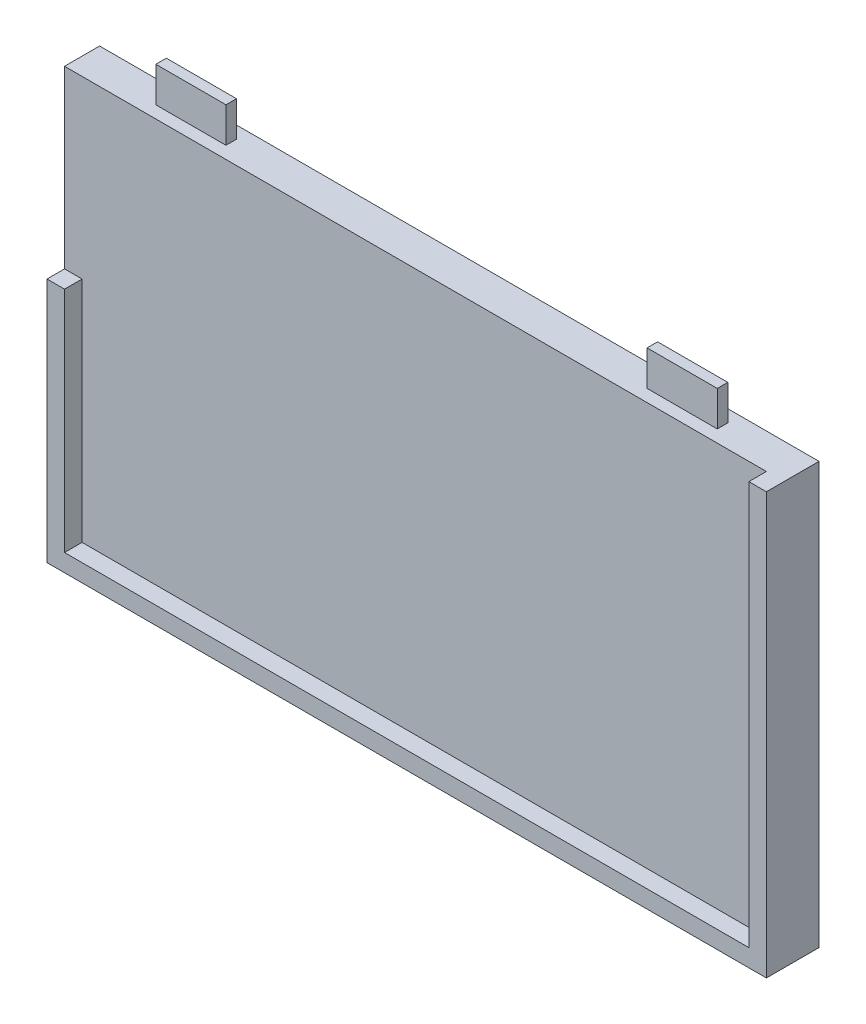
ISO-10303-21;
HEADER;
FILE_DESCRIPTION(('STEP AP214'),'2;1');
FILE_NAME('part.step','',(''),(''),'','','');
FILE_SCHEMA(('AUTOMOTIVE_DESIGN { 1 0 10303 214 1 1 1 1 }'));
ENDSEC;
DATA;
#1=APPLICATION_CONTEXT('core data for automotive mechanical design processes');
#2=APPLICATION_PROTOCOL_DEFINITION('international standard','automotive_design',2000,#1);
#3=PRODUCT_CONTEXT('',#1,'mechanical');
#4=PRODUCT('Part','Part','',(#3));
#5=PRODUCT_RELATED_PRODUCT_CATEGORY('part','',(#4));
#6=PRODUCT_DEFINITION_FORMATION('','',#4);
#7=PRODUCT_DEFINITION_CONTEXT('part definition',#1,'design');
#8=PRODUCT_DEFINITION('design','',#6,#7);
#9=PRODUCT_DEFINITION_SHAPE('','',#8);
#10=(LENGTH_UNIT() NAMED_UNIT(*) SI_UNIT(.MILLI.,.METRE.));
#11=(NAMED_UNIT(*) PLANE_ANGLE_UNIT() SI_UNIT($,.RADIAN.));
#12=(NAMED_UNIT(*) SI_UNIT($,.STERADIAN.) SOLID_ANGLE_UNIT());
#13=UNCERTAINTY_MEASURE_WITH_UNIT(LENGTH_MEASURE(1.E-05),#10,'distance_accuracy_value','');
#14=(GEOMETRIC_REPRESENTATION_CONTEXT(3) GLOBAL_UNCERTAINTY_ASSIGNED_CONTEXT((#13)) GLOBAL_UNIT_ASSIGNED_CONTEXT((#10,
#11,#12)) REPRESENTATION_CONTEXT('',''));
#15=CARTESIAN_POINT('',(0.,0.,0.));
#16=DIRECTION('',(0.,0.,1.));
#17=DIRECTION('',(1.,0.,0.));
#18=AXIS2_PLACEMENT_3D('',#15,#16,#17);
#19=CARTESIAN_POINT('',(102.5,-60.,10.));
#20=DIRECTION('',(0.,1.,0.));
#21=DIRECTION('',(0.,0.,1.));
#22=AXIS2_PLACEMENT_3D('',#19,#20,#21);
#23=PLANE('',#22);
#24=DIRECTION('',(0.,0.,1.));
#25=VECTOR('',#24,1.);
#26=CARTESIAN_POINT('',(17.6,-60.,0.));
#27=LINE('',#26,#25);
#28=CARTESIAN_POINT('',(17.6,-60.,0.));
#29=VERTEX_POINT('',#28);
#30=CARTESIAN_POINT('',(17.6,-60.,3.2));
#31=VERTEX_POINT('',#30);
#32=EDGE_CURVE('E238',#29,#31,#27,.T.);
#33=ORIENTED_EDGE('',*,*,#32,.F.);
#34=DIRECTION('',(1.,0.,0.));
#35=VECTOR('',#34,1.);
#36=CARTESIAN_POINT('',(102.5,-60.,0.));
#37=LINE('',#36,#35);
#38=CARTESIAN_POINT('',(102.5,-60.,0.));
#39=VERTEX_POINT('',#38);
#40=EDGE_CURVE('E450',#29,#39,#37,.T.);
#41=ORIENTED_EDGE('',*,*,#40,.T.);
#42=DIRECTION('',(0.,0.,-1.));
#43=VECTOR('',#42,1.);
#44=CARTESIAN_POINT('',(102.5,-60.,10.));
#45=LINE('',#44,#43);
#46=CARTESIAN_POINT('',(102.5,-60.,15.));
#47=VERTEX_POINT('',#46);
#48=EDGE_CURVE('E453',#47,#39,#45,.T.);
#49=ORIENTED_EDGE('',*,*,#48,.F.);
#50=DIRECTION('',(1.,0.,0.));
#51=VECTOR('',#50,1.);
#52=CARTESIAN_POINT('',(102.5,-60.,15.));
#53=LINE('',#52,#51);
#54=CARTESIAN_POINT('',(-102.5,-60.0000000000001,15.));
#55=VERTEX_POINT('',#54);
#56=EDGE_CURVE('E400',#55,#47,#53,.T.);
#57=ORIENTED_EDGE('',*,*,#56,.F.);
#58=DIRECTION('',(0.,0.,-1.));
#59=VECTOR('',#58,1.);
#60=CARTESIAN_POINT('',(-102.5,-60.,10.));
#61=LINE('',#60,#59);
#62=CARTESIAN_POINT('',(-102.5,-60.,0.));
#63=VERTEX_POINT('',#62);
#64=EDGE_CURVE('E46',#55,#63,#61,.T.);
#65=ORIENTED_EDGE('',*,*,#64,.T.);
#66=CARTESIAN_POINT('',(-17.6,-60.,-2.09488880330588E-13));
#67=VERTEX_POINT('',#66);
#68=EDGE_CURVE('E449',#63,#67,#37,.T.);
#69=ORIENTED_EDGE('',*,*,#68,.T.);
#70=DIRECTION('',(0.,0.,-1.));
#71=VECTOR('',#70,1.);
#72=CARTESIAN_POINT('',(-17.6,-60.,-2.09488880330588E-13));
#73=LINE('',#72,#71);
#74=CARTESIAN_POINT('',(-17.6,-60.,3.19999999999979));
#75=VERTEX_POINT('',#74);
#76=EDGE_CURVE('E279',#75,#67,#73,.T.);
#77=ORIENTED_EDGE('',*,*,#76,.F.);
#78=DIRECTION('',(-1.,0.,0.));
#79=VECTOR('',#78,1.);
#80=CARTESIAN_POINT('',(-17.6,-60.,3.19999999999979));
#81=LINE('',#80,#79);
#82=CARTESIAN_POINT('',(-12.4,-60.,3.19999999999979));
#83=VERTEX_POINT('',#82);
#84=EDGE_CURVE('E278',#83,#75,#81,.T.);
#85=ORIENTED_EDGE('',*,*,#84,.F.);
#86=DIRECTION('',(0.,0.,1.));
#87=VECTOR('',#86,1.);
#88=CARTESIAN_POINT('',(-12.4,-60.,-2.09488880330588E-13));
#89=LINE('',#88,#87);
#90=CARTESIAN_POINT('',(-12.4,-60.,-2.09488880330588E-13));
#91=VERTEX_POINT('',#90);
#92=EDGE_CURVE('E256',#91,#83,#89,.T.);
#93=ORIENTED_EDGE('',*,*,#92,.F.);
#94=CARTESIAN_POINT('',(12.4,-60.,0.));
#95=VERTEX_POINT('',#94);
#96=EDGE_CURVE('E452',#91,#95,#37,.T.);
#97=ORIENTED_EDGE('',*,*,#96,.T.);
#98=DIRECTION('',(0.,0.,-1.));
#99=VECTOR('',#98,1.);
#100=CARTESIAN_POINT('',(12.4,-60.,0.));
#101=LINE('',#100,#99);
#102=CARTESIAN_POINT('',(12.4,-60.,3.2));
#103=VERTEX_POINT('',#102);
#104=EDGE_CURVE('E252',#103,#95,#101,.T.);
#105=ORIENTED_EDGE('',*,*,#104,.F.);
#106=DIRECTION('',(-1.,0.,0.));
#107=VECTOR('',#106,1.);
#108=CARTESIAN_POINT('',(12.4,-60.,3.2));
#109=LINE('',#108,#107);
#110=EDGE_CURVE('E254',#31,#103,#109,.T.);
#111=ORIENTED_EDGE('',*,*,#110,.F.);
#112=EDGE_LOOP('',(#33,#41,#49,#57,#65,#69,#77,#85,#93,#97,#105,#111));
#113=FACE_BOUND('',#112,.T.);
#114=ADVANCED_FACE('F36',(#113),#23,.F.);
#115=CARTESIAN_POINT('',(0.,0.,0.));
#116=DIRECTION('',(0.,0.,-1.));
#117=DIRECTION('',(-1.,0.,0.));
#118=AXIS2_PLACEMENT_3D('',#115,#116,#117);
#119=PLANE('',#118);
#120=DIRECTION('',(1.,0.,0.));
#121=VECTOR('',#120,1.);
#122=CARTESIAN_POINT('',(12.4,-55.,0.));
#123=LINE('',#122,#121);
#124=CARTESIAN_POINT('',(12.4,-55.,0.));
#125=VERTEX_POINT('',#124);
#126=CARTESIAN_POINT('',(17.6,-55.,0.));
#127=VERTEX_POINT('',#126);
#128=EDGE_CURVE('E243',#125,#127,#123,.T.);
#129=ORIENTED_EDGE('',*,*,#128,.F.);
#130=DIRECTION('',(0.,-1.,0.));
#131=VECTOR('',#130,1.);
#132=CARTESIAN_POINT('',(12.4,-55.,0.));
#133=LINE('',#132,#131);
#134=EDGE_CURVE('E261',#125,#95,#133,.T.);
#135=ORIENTED_EDGE('',*,*,#134,.T.);
#136=ORIENTED_EDGE('',*,*,#96,.F.);
#137=DIRECTION('',(0.,-1.,0.));
#138=VECTOR('',#137,1.);
#139=CARTESIAN_POINT('',(-12.4,-55.,-2.09488880330588E-13));
#140=LINE('',#139,#138);
#141=CARTESIAN_POINT('',(-12.4,-55.,-2.09488880330588E-13));
#142=VERTEX_POINT('',#141);
#143=EDGE_CURVE('E277',#142,#91,#140,.T.);
#144=ORIENTED_EDGE('',*,*,#143,.F.);
#145=DIRECTION('',(1.,0.,0.));
#146=VECTOR('',#145,1.);
#147=CARTESIAN_POINT('',(-17.6,-55.,-2.09488880330588E-13));
#148=LINE('',#147,#146);
#149=CARTESIAN_POINT('',(-17.6,-55.,0.));
#150=VERTEX_POINT('',#149);
#151=EDGE_CURVE('E267',#150,#142,#148,.T.);
#152=ORIENTED_EDGE('',*,*,#151,.F.);
#153=DIRECTION('',(0.,-1.,0.));
#154=VECTOR('',#153,1.);
#155=CARTESIAN_POINT('',(-17.6,-55.,-2.09488880330588E-13));
#156=LINE('',#155,#154);
#157=EDGE_CURVE('E271',#150,#67,#156,.T.);
#158=ORIENTED_EDGE('',*,*,#157,.T.);
#159=ORIENTED_EDGE('',*,*,#68,.F.);
#160=DIRECTION('',(0.,-1.,0.));
#161=VECTOR('',#160,1.);
#162=CARTESIAN_POINT('',(-102.5,-60.,0.));
#163=LINE('',#162,#161);
#164=CARTESIAN_POINT('',(-102.5,60.,0.));
#165=VERTEX_POINT('',#164);
#166=EDGE_CURVE('E444',#165,#63,#163,.T.);
#167=ORIENTED_EDGE('',*,*,#166,.F.);
#168=DIRECTION('',(-1.,0.,0.));
#169=VECTOR('',#168,1.);
#170=CARTESIAN_POINT('',(102.5,60.,0.));
#171=LINE('',#170,#169);
#172=CARTESIAN_POINT('',(102.5,60.,0.));
#173=VERTEX_POINT('',#172);
#174=EDGE_CURVE('E436',#173,#165,#171,.T.);
#175=ORIENTED_EDGE('',*,*,#174,.F.);
#176=DIRECTION('',(0.,1.,0.));
#177=VECTOR('',#176,1.);
#178=CARTESIAN_POINT('',(102.5,-60.,0.));
#179=LINE('',#178,#177);
#180=EDGE_CURVE('E439',#39,#173,#179,.T.);
#181=ORIENTED_EDGE('',*,*,#180,.F.);
#182=ORIENTED_EDGE('',*,*,#40,.F.);
#183=DIRECTION('',(0.,-1.,0.));
#184=VECTOR('',#183,1.);
#185=CARTESIAN_POINT('',(17.6,-55.,0.));
#186=LINE('',#185,#184);
#187=EDGE_CURVE('E262',#127,#29,#186,.T.);
#188=ORIENTED_EDGE('',*,*,#187,.F.);
#189=EDGE_LOOP('',(#129,#135,#136,#144,#152,#158,#159,#167,#175,#181,#182,#188));
#190=FACE_BOUND('',#189,.T.);
#191=ADVANCED_FACE('F464',(#190),#119,.T.);
#192=CARTESIAN_POINT('',(102.5,60.,10.));
#193=DIRECTION('',(0.,-1.,0.));
#194=DIRECTION('',(0.,0.,-1.));
#195=AXIS2_PLACEMENT_3D('',#192,#193,#194);
#196=PLANE('',#195);
#197=DIRECTION('',(0.,0.,1.));
#198=VECTOR('',#197,1.);
#199=CARTESIAN_POINT('',(60.0000000000033,60.,3.49999999999956));
#200=LINE('',#199,#198);
#201=CARTESIAN_POINT('',(60.0000000000033,60.,3.49999999999956));
#202=VERTEX_POINT('',#201);
#203=CARTESIAN_POINT('',(60.0000000000033,60.,6.49999999999956));
#204=VERTEX_POINT('',#203);
#205=EDGE_CURVE('E310',#202,#204,#200,.T.);
#206=ORIENTED_EDGE('',*,*,#205,.F.);
#207=DIRECTION('',(-1.,0.,0.));
#208=VECTOR('',#207,1.);
#209=CARTESIAN_POINT('',(60.0000000000033,60.,3.49999999999956));
#210=LINE('',#209,#208);
#211=CARTESIAN_POINT('',(80.0000000000033,60.,3.49999999999956));
#212=VERTEX_POINT('',#211);
#213=EDGE_CURVE('E339',#212,#202,#210,.T.);
#214=ORIENTED_EDGE('',*,*,#213,.F.);
#215=DIRECTION('',(0.,0.,-1.));
#216=VECTOR('',#215,1.);
#217=CARTESIAN_POINT('',(80.0000000000033,60.,3.49999999999956));
#218=LINE('',#217,#216);
#219=CARTESIAN_POINT('',(80.0000000000033,60.,6.49999999999956));
#220=VERTEX_POINT('',#219);
#221=EDGE_CURVE('E345',#220,#212,#218,.T.);
#222=ORIENTED_EDGE('',*,*,#221,.F.);
#223=DIRECTION('',(1.,0.,0.));
#224=VECTOR('',#223,1.);
#225=CARTESIAN_POINT('',(60.0000000000033,60.,6.49999999999956));
#226=LINE('',#225,#224);
#227=EDGE_CURVE('E347',#204,#220,#226,.T.);
#228=ORIENTED_EDGE('',*,*,#227,.F.);
#229=EDGE_LOOP('',(#206,#214,#222,#228));
#230=FACE_BOUND('',#229,.T.);
#231=ORIENTED_EDGE('',*,*,#174,.T.);
#232=DIRECTION('',(0.,0.,-1.));
#233=VECTOR('',#232,1.);
#234=CARTESIAN_POINT('',(-102.5,60.,10.));
#235=LINE('',#234,#233);
#236=CARTESIAN_POINT('',(-102.5,60.,10.));
#237=VERTEX_POINT('',#236);
#238=EDGE_CURVE('E11',#237,#165,#235,.T.);
#239=ORIENTED_EDGE('',*,*,#238,.F.);
#240=DIRECTION('',(-1.,0.,0.));
#241=VECTOR('',#240,1.);
#242=CARTESIAN_POINT('',(102.5,60.,10.));
#243=LINE('',#242,#241);
#244=CARTESIAN_POINT('',(97.5,60.,10.));
#245=VERTEX_POINT('',#244);
#246=EDGE_CURVE('E440',#245,#237,#243,.T.);
#247=ORIENTED_EDGE('',*,*,#246,.F.);
#248=DIRECTION('',(0.,0.,-1.));
#249=VECTOR('',#248,1.);
#250=CARTESIAN_POINT('',(97.5,60.,15.));
#251=LINE('',#250,#249);
#252=CARTESIAN_POINT('',(97.5,60.,15.));
#253=VERTEX_POINT('',#252);
#254=EDGE_CURVE('E427',#253,#245,#251,.T.);
#255=ORIENTED_EDGE('',*,*,#254,.F.);
#256=DIRECTION('',(-1.,0.,0.));
#257=VECTOR('',#256,1.);
#258=CARTESIAN_POINT('',(97.5,60.,15.));
#259=LINE('',#258,#257);
#260=CARTESIAN_POINT('',(102.5,60.,15.));
#261=VERTEX_POINT('',#260);
#262=EDGE_CURVE('E401',#261,#253,#259,.T.);
#263=ORIENTED_EDGE('',*,*,#262,.F.);
#264=DIRECTION('',(0.,0.,-1.));
#265=VECTOR('',#264,1.);
#266=CARTESIAN_POINT('',(102.5,60.,10.));
#267=LINE('',#266,#265);
#268=EDGE_CURVE('E445',#261,#173,#267,.T.);
#269=ORIENTED_EDGE('',*,*,#268,.T.);
#270=EDGE_LOOP('',(#231,#239,#247,#255,#263,#269));
#271=FACE_BOUND('',#270,.T.);
#272=DIRECTION('',(0.,0.,1.));
#273=VECTOR('',#272,1.);
#274=CARTESIAN_POINT('',(-80.0000000000032,60.,3.5));
#275=LINE('',#274,#273);
#276=CARTESIAN_POINT('',(-80.0000000000032,60.,3.5));
#277=VERTEX_POINT('',#276);
#278=CARTESIAN_POINT('',(-80.0000000000032,60.,6.5));
#279=VERTEX_POINT('',#278);
#280=EDGE_CURVE('E303',#277,#279,#275,.T.);
#281=ORIENTED_EDGE('',*,*,#280,.F.);
#282=DIRECTION('',(-1.,0.,0.));
#283=VECTOR('',#282,1.);
#284=CARTESIAN_POINT('',(-60.0000000000032,60.,3.5));
#285=LINE('',#284,#283);
#286=CARTESIAN_POINT('',(-60.0000000000032,60.,3.5));
#287=VERTEX_POINT('',#286);
#288=EDGE_CURVE('E298',#287,#277,#285,.T.);
#289=ORIENTED_EDGE('',*,*,#288,.F.);
#290=DIRECTION('',(0.,0.,-1.));
#291=VECTOR('',#290,1.);
#292=CARTESIAN_POINT('',(-60.0000000000032,60.,3.5));
#293=LINE('',#292,#291);
#294=CARTESIAN_POINT('',(-60.0000000000032,60.,6.5));
#295=VERTEX_POINT('',#294);
#296=EDGE_CURVE('E309',#295,#287,#293,.T.);
#297=ORIENTED_EDGE('',*,*,#296,.F.);
#298=DIRECTION('',(1.,0.,0.));
#299=VECTOR('',#298,1.);
#300=CARTESIAN_POINT('',(-60.0000000000032,60.,6.5));
#301=LINE('',#300,#299);
#302=EDGE_CURVE('E306',#279,#295,#301,.T.);
#303=ORIENTED_EDGE('',*,*,#302,.F.);
#304=EDGE_LOOP('',(#281,#289,#297,#303));
#305=FACE_BOUND('',#304,.T.);
#306=ADVANCED_FACE('F37',(#230,#271,#305),#196,.F.);
#307=CARTESIAN_POINT('',(0.,0.,10.));
#308=DIRECTION('',(0.,0.,-1.));
#309=DIRECTION('',(-1.,0.,0.));
#310=AXIS2_PLACEMENT_3D('',#307,#308,#309);
#311=PLANE('',#310);
#312=DIRECTION('',(-1.,0.,0.));
#313=VECTOR('',#312,1.);
#314=CARTESIAN_POINT('',(-102.5,9.99999999999996,10.));
#315=LINE('',#314,#313);
#316=CARTESIAN_POINT('',(-97.5,9.99999999999996,10.));
#317=VERTEX_POINT('',#316);
#318=CARTESIAN_POINT('',(-102.5,9.99999999999996,10.));
#319=VERTEX_POINT('',#318);
#320=EDGE_CURVE('E384',#317,#319,#315,.T.);
#321=ORIENTED_EDGE('',*,*,#320,.F.);
#322=DIRECTION('',(0.,1.,0.));
#323=VECTOR('',#322,1.);
#324=CARTESIAN_POINT('',(-97.5,-55.0000000000001,10.));
#325=LINE('',#324,#323);
#326=CARTESIAN_POINT('',(-97.5,-55.0000000000001,10.));
#327=VERTEX_POINT('',#326);
#328=EDGE_CURVE('E391',#327,#317,#325,.T.);
#329=ORIENTED_EDGE('',*,*,#328,.F.);
#330=DIRECTION('',(-1.,0.,0.));
#331=VECTOR('',#330,1.);
#332=CARTESIAN_POINT('',(-97.5,-55.0000000000001,10.));
#333=LINE('',#332,#331);
#334=CARTESIAN_POINT('',(97.5,-55.0000000000001,10.));
#335=VERTEX_POINT('',#334);
#336=EDGE_CURVE('E420',#335,#327,#333,.T.);
#337=ORIENTED_EDGE('',*,*,#336,.F.);
#338=DIRECTION('',(0.,-1.,0.));
#339=VECTOR('',#338,1.);
#340=CARTESIAN_POINT('',(97.5,-55.0000000000001,10.));
#341=LINE('',#340,#339);
#342=EDGE_CURVE('E411',#245,#335,#341,.T.);
#343=ORIENTED_EDGE('',*,*,#342,.F.);
#344=ORIENTED_EDGE('',*,*,#246,.T.);
#345=DIRECTION('',(0.,-1.,0.));
#346=VECTOR('',#345,1.);
#347=CARTESIAN_POINT('',(-102.5,-60.,10.));
#348=LINE('',#347,#346);
#349=EDGE_CURVE('E437',#237,#319,#348,.T.);
#350=ORIENTED_EDGE('',*,*,#349,.T.);
#351=EDGE_LOOP('',(#321,#329,#337,#343,#344,#350));
#352=FACE_BOUND('',#351,.T.);
#353=ADVANCED_FACE('F501',(#352),#311,.F.);
#354=CARTESIAN_POINT('',(-102.5,-60.,10.));
#355=DIRECTION('',(1.,0.,0.));
#356=DIRECTION('',(0.,0.,-1.));
#357=AXIS2_PLACEMENT_3D('',#354,#355,#356);
#358=PLANE('',#357);
#359=DIRECTION('',(0.,1.,0.));
#360=VECTOR('',#359,1.);
#361=CARTESIAN_POINT('',(-102.5,40.25,6.6));
#362=LINE('',#361,#360);
#363=CARTESIAN_POINT('',(-102.5,19.75,6.6));
#364=VERTEX_POINT('',#363);
#365=CARTESIAN_POINT('',(-102.5,40.25,6.6));
#366=VERTEX_POINT('',#365);
#367=EDGE_CURVE('E373',#364,#366,#362,.T.);
#368=ORIENTED_EDGE('',*,*,#367,.F.);
#369=DIRECTION('',(0.,0.,1.));
#370=VECTOR('',#369,1.);
#371=CARTESIAN_POINT('',(-102.5,19.75,3.4));
#372=LINE('',#371,#370);
#373=CARTESIAN_POINT('',(-102.5,19.75,3.4));
#374=VERTEX_POINT('',#373);
#375=EDGE_CURVE('E327',#374,#364,#372,.T.);
#376=ORIENTED_EDGE('',*,*,#375,.F.);
#377=DIRECTION('',(0.,-1.,0.));
#378=VECTOR('',#377,1.);
#379=CARTESIAN_POINT('',(-102.5,40.25,3.4));
#380=LINE('',#379,#378);
#381=CARTESIAN_POINT('',(-102.5,40.25,3.4));
#382=VERTEX_POINT('',#381);
#383=EDGE_CURVE('E365',#382,#374,#380,.T.);
#384=ORIENTED_EDGE('',*,*,#383,.F.);
#385=DIRECTION('',(0.,0.,-1.));
#386=VECTOR('',#385,1.);
#387=CARTESIAN_POINT('',(-102.5,40.25,3.4));
#388=LINE('',#387,#386);
#389=EDGE_CURVE('E376',#366,#382,#388,.T.);
#390=ORIENTED_EDGE('',*,*,#389,.F.);
#391=EDGE_LOOP('',(#368,#376,#384,#390));
#392=FACE_BOUND('',#391,.T.);
#393=ORIENTED_EDGE('',*,*,#166,.T.);
#394=ORIENTED_EDGE('',*,*,#64,.F.);
#395=DIRECTION('',(0.,-1.,0.));
#396=VECTOR('',#395,1.);
#397=CARTESIAN_POINT('',(-102.5,-60.0000000000001,15.));
#398=LINE('',#397,#396);
#399=CARTESIAN_POINT('',(-102.5,9.99999999999996,15.));
#400=VERTEX_POINT('',#399);
#401=EDGE_CURVE('E394',#400,#55,#398,.T.);
#402=ORIENTED_EDGE('',*,*,#401,.F.);
#403=DIRECTION('',(0.,0.,-1.));
#404=VECTOR('',#403,1.);
#405=CARTESIAN_POINT('',(-102.5,9.99999999999996,15.));
#406=LINE('',#405,#404);
#407=EDGE_CURVE('E433',#400,#319,#406,.T.);
#408=ORIENTED_EDGE('',*,*,#407,.T.);
#409=ORIENTED_EDGE('',*,*,#349,.F.);
#410=ORIENTED_EDGE('',*,*,#238,.T.);
#411=EDGE_LOOP('',(#393,#394,#402,#408,#409,#410));
#412=FACE_BOUND('',#411,.T.);
#413=ADVANCED_FACE('F492',(#392,#412),#358,.F.);
#414=CARTESIAN_POINT('',(102.5,-60.,10.));
#415=DIRECTION('',(-1.,0.,0.));
#416=DIRECTION('',(0.,0.,1.));
#417=AXIS2_PLACEMENT_3D('',#414,#415,#416);
#418=PLANE('',#417);
#419=ORIENTED_EDGE('',*,*,#180,.T.);
#420=ORIENTED_EDGE('',*,*,#268,.F.);
#421=DIRECTION('',(0.,1.,0.));
#422=VECTOR('',#421,1.);
#423=CARTESIAN_POINT('',(102.5,60.,15.));
#424=LINE('',#423,#422);
#425=EDGE_CURVE('E397',#47,#261,#424,.T.);
#426=ORIENTED_EDGE('',*,*,#425,.F.);
#427=ORIENTED_EDGE('',*,*,#48,.T.);
#428=EDGE_LOOP('',(#419,#420,#426,#427));
#429=FACE_BOUND('',#428,.T.);
#430=ADVANCED_FACE('F484',(#429),#418,.F.);
#431=CARTESIAN_POINT('',(-102.5,9.99999999999996,15.));
#432=DIRECTION('',(0.,-1.,0.));
#433=DIRECTION('',(0.,0.,-1.));
#434=AXIS2_PLACEMENT_3D('',#431,#432,#433);
#435=PLANE('',#434);
#436=ORIENTED_EDGE('',*,*,#320,.T.);
#437=ORIENTED_EDGE('',*,*,#407,.F.);
#438=DIRECTION('',(-1.,0.,0.));
#439=VECTOR('',#438,1.);
#440=CARTESIAN_POINT('',(-102.5,9.99999999999996,15.));
#441=LINE('',#440,#439);
#442=CARTESIAN_POINT('',(-97.5,9.99999999999996,15.));
#443=VERTEX_POINT('',#442);
#444=EDGE_CURVE('E388',#443,#400,#441,.T.);
#445=ORIENTED_EDGE('',*,*,#444,.F.);
#446=DIRECTION('',(0.,0.,-1.));
#447=VECTOR('',#446,1.);
#448=CARTESIAN_POINT('',(-97.5,9.99999999999996,15.));
#449=LINE('',#448,#447);
#450=EDGE_CURVE('E412',#443,#317,#449,.T.);
#451=ORIENTED_EDGE('',*,*,#450,.T.);
#452=EDGE_LOOP('',(#436,#437,#445,#451));
#453=FACE_BOUND('',#452,.T.);
#454=ADVANCED_FACE('F498',(#453),#435,.F.);
#455=CARTESIAN_POINT('',(97.5,-55.0000000000001,15.));
#456=DIRECTION('',(1.,0.,0.));
#457=DIRECTION('',(0.,0.,-1.));
#458=AXIS2_PLACEMENT_3D('',#455,#456,#457);
#459=PLANE('',#458);
#460=ORIENTED_EDGE('',*,*,#342,.T.);
#461=DIRECTION('',(0.,0.,-1.));
#462=VECTOR('',#461,1.);
#463=CARTESIAN_POINT('',(97.5,-55.0000000000001,15.));
#464=LINE('',#463,#462);
#465=CARTESIAN_POINT('',(97.5,-55.0000000000001,15.));
#466=VERTEX_POINT('',#465);
#467=EDGE_CURVE('E430',#466,#335,#464,.T.);
#468=ORIENTED_EDGE('',*,*,#467,.F.);
#469=DIRECTION('',(0.,-1.,0.));
#470=VECTOR('',#469,1.);
#471=CARTESIAN_POINT('',(97.5,-55.0000000000001,15.));
#472=LINE('',#471,#470);
#473=EDGE_CURVE('E403',#253,#466,#472,.T.);
#474=ORIENTED_EDGE('',*,*,#473,.F.);
#475=ORIENTED_EDGE('',*,*,#254,.T.);
#476=EDGE_LOOP('',(#460,#468,#474,#475));
#477=FACE_BOUND('',#476,.T.);
#478=ADVANCED_FACE('F512',(#477),#459,.F.);
#479=CARTESIAN_POINT('',(-97.5,-55.0000000000001,15.));
#480=DIRECTION('',(0.,-1.,0.));
#481=DIRECTION('',(0.,0.,-1.));
#482=AXIS2_PLACEMENT_3D('',#479,#480,#481);
#483=PLANE('',#482);
#484=ORIENTED_EDGE('',*,*,#336,.T.);
#485=DIRECTION('',(0.,0.,-1.));
#486=VECTOR('',#485,1.);
#487=CARTESIAN_POINT('',(-97.5,-55.0000000000001,15.));
#488=LINE('',#487,#486);
#489=CARTESIAN_POINT('',(-97.5,-55.0000000000001,15.));
#490=VERTEX_POINT('',#489);
#491=EDGE_CURVE('E425',#490,#327,#488,.T.);
#492=ORIENTED_EDGE('',*,*,#491,.F.);
#493=DIRECTION('',(-1.,0.,0.));
#494=VECTOR('',#493,1.);
#495=CARTESIAN_POINT('',(-97.5,-55.0000000000001,15.));
#496=LINE('',#495,#494);
#497=EDGE_CURVE('E410',#466,#490,#496,.T.);
#498=ORIENTED_EDGE('',*,*,#497,.F.);
#499=ORIENTED_EDGE('',*,*,#467,.T.);
#500=EDGE_LOOP('',(#484,#492,#498,#499));
#501=FACE_BOUND('',#500,.T.);
#502=ADVANCED_FACE('F507',(#501),#483,.F.);
#503=CARTESIAN_POINT('',(-97.5,-55.0000000000001,15.));
#504=DIRECTION('',(-1.,0.,0.));
#505=DIRECTION('',(0.,-1.,0.));
#506=AXIS2_PLACEMENT_3D('',#503,#504,#505);
#507=PLANE('',#506);
#508=ORIENTED_EDGE('',*,*,#328,.T.);
#509=ORIENTED_EDGE('',*,*,#450,.F.);
#510=DIRECTION('',(0.,1.,0.));
#511=VECTOR('',#510,1.);
#512=CARTESIAN_POINT('',(-97.5,-55.0000000000001,15.));
#513=LINE('',#512,#511);
#514=EDGE_CURVE('E406',#490,#443,#513,.T.);
#515=ORIENTED_EDGE('',*,*,#514,.F.);
#516=ORIENTED_EDGE('',*,*,#491,.T.);
#517=EDGE_LOOP('',(#508,#509,#515,#516));
#518=FACE_BOUND('',#517,.T.);
#519=ADVANCED_FACE('F503',(#518),#507,.F.);
#520=CARTESIAN_POINT('',(0.,0.,15.));
#521=DIRECTION('',(0.,0.,1.));
#522=DIRECTION('',(1.,0.,0.));
#523=AXIS2_PLACEMENT_3D('',#520,#521,#522);
#524=PLANE('',#523);
#525=ORIENTED_EDGE('',*,*,#444,.T.);
#526=ORIENTED_EDGE('',*,*,#401,.T.);
#527=ORIENTED_EDGE('',*,*,#56,.T.);
#528=ORIENTED_EDGE('',*,*,#425,.T.);
#529=ORIENTED_EDGE('',*,*,#262,.T.);
#530=ORIENTED_EDGE('',*,*,#473,.T.);
#531=ORIENTED_EDGE('',*,*,#497,.T.);
#532=ORIENTED_EDGE('',*,*,#514,.T.);
#533=EDGE_LOOP('',(#525,#526,#527,#528,#529,#530,#531,#532));
#534=FACE_BOUND('',#533,.T.);
#535=ADVANCED_FACE('F495',(#534),#524,.T.);
#536=CARTESIAN_POINT('',(-92.5,19.75,3.4));
#537=DIRECTION('',(0.,-1.,0.));
#538=DIRECTION('',(0.,0.,-1.));
#539=AXIS2_PLACEMENT_3D('',#536,#537,#538);
#540=PLANE('',#539);
#541=ORIENTED_EDGE('',*,*,#375,.T.);
#542=DIRECTION('',(-1.,0.,0.));
#543=VECTOR('',#542,1.);
#544=CARTESIAN_POINT('',(-92.5,19.75,6.6));
#545=LINE('',#544,#543);
#546=CARTESIAN_POINT('',(-92.5,19.75,6.6));
#547=VERTEX_POINT('',#546);
#548=EDGE_CURVE('E371',#547,#364,#545,.T.);
#549=ORIENTED_EDGE('',*,*,#548,.F.);
#550=DIRECTION('',(0.,0.,1.));
#551=VECTOR('',#550,1.);
#552=CARTESIAN_POINT('',(-92.5,19.75,3.4));
#553=LINE('',#552,#551);
#554=CARTESIAN_POINT('',(-92.5,19.75,3.4));
#555=VERTEX_POINT('',#554);
#556=EDGE_CURVE('E356',#555,#547,#553,.T.);
#557=ORIENTED_EDGE('',*,*,#556,.F.);
#558=DIRECTION('',(-1.,0.,0.));
#559=VECTOR('',#558,1.);
#560=CARTESIAN_POINT('',(-92.5,19.75,3.4));
#561=LINE('',#560,#559);
#562=EDGE_CURVE('E382',#555,#374,#561,.T.);
#563=ORIENTED_EDGE('',*,*,#562,.T.);
#564=EDGE_LOOP('',(#541,#549,#557,#563));
#565=FACE_BOUND('',#564,.T.);
#566=ADVANCED_FACE('F546',(#565),#540,.F.);
#567=CARTESIAN_POINT('',(-92.5,40.25,3.4));
#568=DIRECTION('',(0.,0.,-1.));
#569=DIRECTION('',(-1.,0.,0.));
#570=AXIS2_PLACEMENT_3D('',#567,#568,#569);
#571=PLANE('',#570);
#572=ORIENTED_EDGE('',*,*,#383,.T.);
#573=ORIENTED_EDGE('',*,*,#562,.F.);
#574=DIRECTION('',(0.,-1.,0.));
#575=VECTOR('',#574,1.);
#576=CARTESIAN_POINT('',(-92.5,40.25,3.4));
#577=LINE('',#576,#575);
#578=CARTESIAN_POINT('',(-92.5,40.25,3.4));
#579=VERTEX_POINT('',#578);
#580=EDGE_CURVE('E368',#579,#555,#577,.T.);
#581=ORIENTED_EDGE('',*,*,#580,.F.);
#582=DIRECTION('',(-1.,0.,0.));
#583=VECTOR('',#582,1.);
#584=CARTESIAN_POINT('',(-92.5,40.25,3.4));
#585=LINE('',#584,#583);
#586=EDGE_CURVE('E381',#579,#382,#585,.T.);
#587=ORIENTED_EDGE('',*,*,#586,.T.);
#588=EDGE_LOOP('',(#572,#573,#581,#587));
#589=FACE_BOUND('',#588,.T.);
#590=ADVANCED_FACE('F553',(#589),#571,.F.);
#591=CARTESIAN_POINT('',(-92.5,40.25,3.4));
#592=DIRECTION('',(0.,1.,0.));
#593=DIRECTION('',(0.,0.,1.));
#594=AXIS2_PLACEMENT_3D('',#591,#592,#593);
#595=PLANE('',#594);
#596=ORIENTED_EDGE('',*,*,#389,.T.);
#597=ORIENTED_EDGE('',*,*,#586,.F.);
#598=DIRECTION('',(0.,0.,-1.));
#599=VECTOR('',#598,1.);
#600=CARTESIAN_POINT('',(-92.5,40.25,3.4));
#601=LINE('',#600,#599);
#602=CARTESIAN_POINT('',(-92.5,40.25,6.6));
#603=VERTEX_POINT('',#602);
#604=EDGE_CURVE('E362',#603,#579,#601,.T.);
#605=ORIENTED_EDGE('',*,*,#604,.F.);
#606=DIRECTION('',(-1.,0.,0.));
#607=VECTOR('',#606,1.);
#608=CARTESIAN_POINT('',(-92.5,40.25,6.6));
#609=LINE('',#608,#607);
#610=EDGE_CURVE('E387',#603,#366,#609,.T.);
#611=ORIENTED_EDGE('',*,*,#610,.T.);
#612=EDGE_LOOP('',(#596,#597,#605,#611));
#613=FACE_BOUND('',#612,.T.);
#614=ADVANCED_FACE('F551',(#613),#595,.F.);
#615=CARTESIAN_POINT('',(-92.5,40.25,6.6));
#616=DIRECTION('',(0.,0.,1.));
#617=DIRECTION('',(1.,0.,0.));
#618=AXIS2_PLACEMENT_3D('',#615,#616,#617);
#619=PLANE('',#618);
#620=ORIENTED_EDGE('',*,*,#367,.T.);
#621=ORIENTED_EDGE('',*,*,#610,.F.);
#622=DIRECTION('',(0.,1.,0.));
#623=VECTOR('',#622,1.);
#624=CARTESIAN_POINT('',(-92.5,40.25,6.6));
#625=LINE('',#624,#623);
#626=EDGE_CURVE('E363',#547,#603,#625,.T.);
#627=ORIENTED_EDGE('',*,*,#626,.F.);
#628=ORIENTED_EDGE('',*,*,#548,.T.);
#629=EDGE_LOOP('',(#620,#621,#627,#628));
#630=FACE_BOUND('',#629,.T.);
#631=ADVANCED_FACE('F544',(#630),#619,.F.);
#632=CARTESIAN_POINT('',(-92.5,0.,0.));
#633=DIRECTION('',(1.,0.,0.));
#634=DIRECTION('',(0.,0.,-1.));
#635=AXIS2_PLACEMENT_3D('',#632,#633,#634);
#636=PLANE('',#635);
#637=ORIENTED_EDGE('',*,*,#556,.T.);
#638=ORIENTED_EDGE('',*,*,#626,.T.);
#639=ORIENTED_EDGE('',*,*,#604,.T.);
#640=ORIENTED_EDGE('',*,*,#580,.T.);
#641=EDGE_LOOP('',(#637,#638,#639,#640));
#642=FACE_BOUND('',#641,.T.);
#643=ADVANCED_FACE('F554',(#642),#636,.F.);
#644=CARTESIAN_POINT('',(60.0000000000033,70.,3.49999999999956));
#645=DIRECTION('',(1.,0.,0.));
#646=DIRECTION('',(0.,0.,-1.));
#647=AXIS2_PLACEMENT_3D('',#644,#645,#646);
#648=PLANE('',#647);
#649=ORIENTED_EDGE('',*,*,#205,.T.);
#650=DIRECTION('',(0.,-1.,0.));
#651=VECTOR('',#650,1.);
#652=CARTESIAN_POINT('',(60.0000000000033,70.,6.49999999999956));
#653=LINE('',#652,#651);
#654=CARTESIAN_POINT('',(60.0000000000033,70.,6.49999999999956));
#655=VERTEX_POINT('',#654);
#656=EDGE_CURVE('E264',#655,#204,#653,.T.);
#657=ORIENTED_EDGE('',*,*,#656,.F.);
#658=DIRECTION('',(0.,0.,1.));
#659=VECTOR('',#658,1.);
#660=CARTESIAN_POINT('',(60.0000000000033,70.,3.49999999999956));
#661=LINE('',#660,#659);
#662=CARTESIAN_POINT('',(60.0000000000033,70.,3.49999999999956));
#663=VERTEX_POINT('',#662);
#664=EDGE_CURVE('E344',#663,#655,#661,.T.);
#665=ORIENTED_EDGE('',*,*,#664,.F.);
#666=DIRECTION('',(0.,-1.,0.));
#667=VECTOR('',#666,1.);
#668=CARTESIAN_POINT('',(60.0000000000033,70.,3.49999999999956));
#669=LINE('',#668,#667);
#670=EDGE_CURVE('E332',#663,#202,#669,.T.);
#671=ORIENTED_EDGE('',*,*,#670,.T.);
#672=EDGE_LOOP('',(#649,#657,#665,#671));
#673=FACE_BOUND('',#672,.T.);
#674=ADVANCED_FACE('F560',(#673),#648,.F.);
#675=CARTESIAN_POINT('',(60.0000000000033,70.,6.49999999999956));
#676=DIRECTION('',(0.,0.,-1.));
#677=DIRECTION('',(-1.,0.,0.));
#678=AXIS2_PLACEMENT_3D('',#675,#676,#677);
#679=PLANE('',#678);
#680=ORIENTED_EDGE('',*,*,#227,.T.);
#681=DIRECTION('',(0.,-1.,0.));
#682=VECTOR('',#681,1.);
#683=CARTESIAN_POINT('',(80.0000000000033,70.,6.49999999999956));
#684=LINE('',#683,#682);
#685=CARTESIAN_POINT('',(80.0000000000033,70.,6.49999999999956));
#686=VERTEX_POINT('',#685);
#687=EDGE_CURVE('E326',#686,#220,#684,.T.);
#688=ORIENTED_EDGE('',*,*,#687,.F.);
#689=DIRECTION('',(1.,0.,0.));
#690=VECTOR('',#689,1.);
#691=CARTESIAN_POINT('',(60.0000000000033,70.,6.49999999999956));
#692=LINE('',#691,#690);
#693=EDGE_CURVE('E354',#655,#686,#692,.T.);
#694=ORIENTED_EDGE('',*,*,#693,.F.);
#695=ORIENTED_EDGE('',*,*,#656,.T.);
#696=EDGE_LOOP('',(#680,#688,#694,#695));
#697=FACE_BOUND('',#696,.T.);
#698=ADVANCED_FACE('F562',(#697),#679,.F.);
#699=CARTESIAN_POINT('',(80.0000000000033,70.,3.49999999999956));
#700=DIRECTION('',(-1.,0.,0.));
#701=DIRECTION('',(0.,0.,1.));
#702=AXIS2_PLACEMENT_3D('',#699,#700,#701);
#703=PLANE('',#702);
#704=ORIENTED_EDGE('',*,*,#221,.T.);
#705=DIRECTION('',(0.,-1.,0.));
#706=VECTOR('',#705,1.);
#707=CARTESIAN_POINT('',(80.0000000000033,70.,3.49999999999956));
#708=LINE('',#707,#706);
#709=CARTESIAN_POINT('',(80.0000000000033,70.,3.49999999999956));
#710=VERTEX_POINT('',#709);
#711=EDGE_CURVE('E335',#710,#212,#708,.T.);
#712=ORIENTED_EDGE('',*,*,#711,.F.);
#713=DIRECTION('',(0.,0.,-1.));
#714=VECTOR('',#713,1.);
#715=CARTESIAN_POINT('',(80.0000000000033,70.,3.49999999999956));
#716=LINE('',#715,#714);
#717=EDGE_CURVE('E355',#686,#710,#716,.T.);
#718=ORIENTED_EDGE('',*,*,#717,.F.);
#719=ORIENTED_EDGE('',*,*,#687,.T.);
#720=EDGE_LOOP('',(#704,#712,#718,#719));
#721=FACE_BOUND('',#720,.T.);
#722=ADVANCED_FACE('F645',(#721),#703,.F.);
#723=CARTESIAN_POINT('',(60.0000000000033,70.,3.49999999999956));
#724=DIRECTION('',(0.,0.,1.));
#725=DIRECTION('',(1.,0.,0.));
#726=AXIS2_PLACEMENT_3D('',#723,#724,#725);
#727=PLANE('',#726);
#728=ORIENTED_EDGE('',*,*,#213,.T.);
#729=ORIENTED_EDGE('',*,*,#670,.F.);
#730=DIRECTION('',(-1.,0.,0.));
#731=VECTOR('',#730,1.);
#732=CARTESIAN_POINT('',(60.0000000000033,70.,3.49999999999956));
#733=LINE('',#732,#731);
#734=EDGE_CURVE('E336',#710,#663,#733,.T.);
#735=ORIENTED_EDGE('',*,*,#734,.F.);
#736=ORIENTED_EDGE('',*,*,#711,.T.);
#737=EDGE_LOOP('',(#728,#729,#735,#736));
#738=FACE_BOUND('',#737,.T.);
#739=ADVANCED_FACE('F655',(#738),#727,.F.);
#740=CARTESIAN_POINT('',(0.,70.,0.));
#741=DIRECTION('',(0.,1.,0.));
#742=DIRECTION('',(0.,0.,1.));
#743=AXIS2_PLACEMENT_3D('',#740,#741,#742);
#744=PLANE('',#743);
#745=ORIENTED_EDGE('',*,*,#664,.T.);
#746=ORIENTED_EDGE('',*,*,#693,.T.);
#747=ORIENTED_EDGE('',*,*,#717,.T.);
#748=ORIENTED_EDGE('',*,*,#734,.T.);
#749=EDGE_LOOP('',(#745,#746,#747,#748));
#750=FACE_BOUND('',#749,.T.);
#751=ADVANCED_FACE('F569',(#750),#744,.T.);
#752=CARTESIAN_POINT('',(-80.0000000000032,70.,3.5));
#753=DIRECTION('',(1.,0.,0.));
#754=DIRECTION('',(0.,0.,-1.));
#755=AXIS2_PLACEMENT_3D('',#752,#753,#754);
#756=PLANE('',#755);
#757=ORIENTED_EDGE('',*,*,#280,.T.);
#758=DIRECTION('',(0.,-1.,0.));
#759=VECTOR('',#758,1.);
#760=CARTESIAN_POINT('',(-80.0000000000032,70.,6.5));
#761=LINE('',#760,#759);
#762=CARTESIAN_POINT('',(-80.0000000000032,70.,6.5));
#763=VERTEX_POINT('',#762);
#764=EDGE_CURVE('E324',#763,#279,#761,.T.);
#765=ORIENTED_EDGE('',*,*,#764,.F.);
#766=DIRECTION('',(0.,0.,1.));
#767=VECTOR('',#766,1.);
#768=CARTESIAN_POINT('',(-80.0000000000032,70.,3.5));
#769=LINE('',#768,#767);
#770=CARTESIAN_POINT('',(-80.0000000000032,70.,3.5));
#771=VERTEX_POINT('',#770);
#772=EDGE_CURVE('E292',#771,#763,#769,.T.);
#773=ORIENTED_EDGE('',*,*,#772,.F.);
#774=DIRECTION('',(0.,-1.,0.));
#775=VECTOR('',#774,1.);
#776=CARTESIAN_POINT('',(-80.0000000000032,70.,3.5));
#777=LINE('',#776,#775);
#778=EDGE_CURVE('E305',#771,#277,#777,.T.);
#779=ORIENTED_EDGE('',*,*,#778,.T.);
#780=EDGE_LOOP('',(#757,#765,#773,#779));
#781=FACE_BOUND('',#780,.T.);
#782=ADVANCED_FACE('F668',(#781),#756,.F.);
#783=CARTESIAN_POINT('',(-60.0000000000032,70.,6.5));
#784=DIRECTION('',(0.,0.,-1.));
#785=DIRECTION('',(-1.,0.,0.));
#786=AXIS2_PLACEMENT_3D('',#783,#784,#785);
#787=PLANE('',#786);
#788=ORIENTED_EDGE('',*,*,#302,.T.);
#789=DIRECTION('',(0.,-1.,0.));
#790=VECTOR('',#789,1.);
#791=CARTESIAN_POINT('',(-60.0000000000032,70.,6.5));
#792=LINE('',#791,#790);
#793=CARTESIAN_POINT('',(-60.0000000000032,70.,6.5));
#794=VERTEX_POINT('',#793);
#795=EDGE_CURVE('E318',#794,#295,#792,.T.);
#796=ORIENTED_EDGE('',*,*,#795,.F.);
#797=DIRECTION('',(1.,0.,0.));
#798=VECTOR('',#797,1.);
#799=CARTESIAN_POINT('',(-60.0000000000032,70.,6.5));
#800=LINE('',#799,#798);
#801=EDGE_CURVE('E294',#763,#794,#800,.T.);
#802=ORIENTED_EDGE('',*,*,#801,.F.);
#803=ORIENTED_EDGE('',*,*,#764,.T.);
#804=EDGE_LOOP('',(#788,#796,#802,#803));
#805=FACE_BOUND('',#804,.T.);
#806=ADVANCED_FACE('F679',(#805),#787,.F.);
#807=CARTESIAN_POINT('',(-60.0000000000032,70.,3.5));
#808=DIRECTION('',(-1.,0.,0.));
#809=DIRECTION('',(0.,0.,1.));
#810=AXIS2_PLACEMENT_3D('',#807,#808,#809);
#811=PLANE('',#810);
#812=ORIENTED_EDGE('',*,*,#296,.T.);
#813=DIRECTION('',(0.,-1.,0.));
#814=VECTOR('',#813,1.);
#815=CARTESIAN_POINT('',(-60.0000000000032,70.,3.5));
#816=LINE('',#815,#814);
#817=CARTESIAN_POINT('',(-60.0000000000032,70.,3.5));
#818=VERTEX_POINT('',#817);
#819=EDGE_CURVE('E320',#818,#287,#816,.T.);
#820=ORIENTED_EDGE('',*,*,#819,.F.);
#821=DIRECTION('',(0.,0.,-1.));
#822=VECTOR('',#821,1.);
#823=CARTESIAN_POINT('',(-60.0000000000032,70.,3.5));
#824=LINE('',#823,#822);
#825=EDGE_CURVE('E296',#794,#818,#824,.T.);
#826=ORIENTED_EDGE('',*,*,#825,.F.);
#827=ORIENTED_EDGE('',*,*,#795,.T.);
#828=EDGE_LOOP('',(#812,#820,#826,#827));
#829=FACE_BOUND('',#828,.T.);
#830=ADVANCED_FACE('F689',(#829),#811,.F.);
#831=CARTESIAN_POINT('',(-60.0000000000032,70.,3.5));
#832=DIRECTION('',(0.,0.,1.));
#833=DIRECTION('',(1.,0.,0.));
#834=AXIS2_PLACEMENT_3D('',#831,#832,#833);
#835=PLANE('',#834);
#836=ORIENTED_EDGE('',*,*,#288,.T.);
#837=ORIENTED_EDGE('',*,*,#778,.F.);
#838=DIRECTION('',(-1.,0.,0.));
#839=VECTOR('',#838,1.);
#840=CARTESIAN_POINT('',(-60.0000000000032,70.,3.5));
#841=LINE('',#840,#839);
#842=EDGE_CURVE('E297',#818,#771,#841,.T.);
#843=ORIENTED_EDGE('',*,*,#842,.F.);
#844=ORIENTED_EDGE('',*,*,#819,.T.);
#845=EDGE_LOOP('',(#836,#837,#843,#844));
#846=FACE_BOUND('',#845,.T.);
#847=ADVANCED_FACE('F697',(#846),#835,.F.);
#848=CARTESIAN_POINT('',(0.,70.,0.));
#849=DIRECTION('',(0.,-1.,0.));
#850=DIRECTION('',(0.,0.,-1.));
#851=AXIS2_PLACEMENT_3D('',#848,#849,#850);
#852=PLANE('',#851);
#853=ORIENTED_EDGE('',*,*,#772,.T.);
#854=ORIENTED_EDGE('',*,*,#801,.T.);
#855=ORIENTED_EDGE('',*,*,#825,.T.);
#856=ORIENTED_EDGE('',*,*,#842,.T.);
#857=EDGE_LOOP('',(#853,#854,#855,#856));
#858=FACE_BOUND('',#857,.T.);
#859=ADVANCED_FACE('F706',(#858),#852,.F.);
#860=CARTESIAN_POINT('',(-12.4,-55.,-2.09488880330588E-13));
#861=DIRECTION('',(1.,0.,0.));
#862=DIRECTION('',(0.,0.,-1.));
#863=AXIS2_PLACEMENT_3D('',#860,#861,#862);
#864=PLANE('',#863);
#865=ORIENTED_EDGE('',*,*,#92,.T.);
#866=DIRECTION('',(0.,-1.,0.));
#867=VECTOR('',#866,1.);
#868=CARTESIAN_POINT('',(-12.4,-55.,3.19999999999979));
#869=LINE('',#868,#867);
#870=CARTESIAN_POINT('',(-12.4,-55.,3.19999999999979));
#871=VERTEX_POINT('',#870);
#872=EDGE_CURVE('E266',#871,#83,#869,.T.);
#873=ORIENTED_EDGE('',*,*,#872,.F.);
#874=DIRECTION('',(0.,0.,1.));
#875=VECTOR('',#874,1.);
#876=CARTESIAN_POINT('',(-12.4,-55.,-2.09488880330588E-13));
#877=LINE('',#876,#875);
#878=EDGE_CURVE('E282',#142,#871,#877,.T.);
#879=ORIENTED_EDGE('',*,*,#878,.F.);
#880=ORIENTED_EDGE('',*,*,#143,.T.);
#881=EDGE_LOOP('',(#865,#873,#879,#880));
#882=FACE_BOUND('',#881,.T.);
#883=ADVANCED_FACE('F479',(#882),#864,.F.);
#884=CARTESIAN_POINT('',(-17.6,-55.,-2.09488880330588E-13));
#885=DIRECTION('',(-1.,0.,0.));
#886=DIRECTION('',(0.,0.,1.));
#887=AXIS2_PLACEMENT_3D('',#884,#885,#886);
#888=PLANE('',#887);
#889=ORIENTED_EDGE('',*,*,#76,.T.);
#890=ORIENTED_EDGE('',*,*,#157,.F.);
#891=DIRECTION('',(0.,0.,-1.));
#892=VECTOR('',#891,1.);
#893=CARTESIAN_POINT('',(-17.6,-55.,-2.09488880330588E-13));
#894=LINE('',#893,#892);
#895=CARTESIAN_POINT('',(-17.6,-55.,3.19999999999979));
#896=VERTEX_POINT('',#895);
#897=EDGE_CURVE('E62',#896,#150,#894,.T.);
#898=ORIENTED_EDGE('',*,*,#897,.F.);
#899=DIRECTION('',(0.,-1.,0.));
#900=VECTOR('',#899,1.);
#901=CARTESIAN_POINT('',(-17.6,-55.,3.19999999999979));
#902=LINE('',#901,#900);
#903=EDGE_CURVE('E272',#896,#75,#902,.T.);
#904=ORIENTED_EDGE('',*,*,#903,.T.);
#905=EDGE_LOOP('',(#889,#890,#898,#904));
#906=FACE_BOUND('',#905,.T.);
#907=ADVANCED_FACE('F469',(#906),#888,.F.);
#908=CARTESIAN_POINT('',(-17.6,-55.,3.19999999999979));
#909=DIRECTION('',(0.,0.,1.));
#910=DIRECTION('',(1.,0.,0.));
#911=AXIS2_PLACEMENT_3D('',#908,#909,#910);
#912=PLANE('',#911);
#913=ORIENTED_EDGE('',*,*,#84,.T.);
#914=ORIENTED_EDGE('',*,*,#903,.F.);
#915=DIRECTION('',(-1.,0.,0.));
#916=VECTOR('',#915,1.);
#917=CARTESIAN_POINT('',(-17.6,-55.,3.19999999999979));
#918=LINE('',#917,#916);
#919=EDGE_CURVE('E286',#871,#896,#918,.T.);
#920=ORIENTED_EDGE('',*,*,#919,.F.);
#921=ORIENTED_EDGE('',*,*,#872,.T.);
#922=EDGE_LOOP('',(#913,#914,#920,#921));
#923=FACE_BOUND('',#922,.T.);
#924=ADVANCED_FACE('F473',(#923),#912,.F.);
#925=CARTESIAN_POINT('',(0.,-55.,0.));
#926=DIRECTION('',(0.,1.,0.));
#927=DIRECTION('',(0.,0.,1.));
#928=AXIS2_PLACEMENT_3D('',#925,#926,#927);
#929=PLANE('',#928);
#930=ORIENTED_EDGE('',*,*,#878,.T.);
#931=ORIENTED_EDGE('',*,*,#919,.T.);
#932=ORIENTED_EDGE('',*,*,#897,.T.);
#933=ORIENTED_EDGE('',*,*,#151,.T.);
#934=EDGE_LOOP('',(#930,#931,#932,#933));
#935=FACE_BOUND('',#934,.T.);
#936=ADVANCED_FACE('F756',(#935),#929,.F.);
#937=CARTESIAN_POINT('',(17.6,-55.,0.));
#938=DIRECTION('',(1.,0.,0.));
#939=DIRECTION('',(0.,0.,-1.));
#940=AXIS2_PLACEMENT_3D('',#937,#938,#939);
#941=PLANE('',#940);
#942=ORIENTED_EDGE('',*,*,#32,.T.);
#943=DIRECTION('',(0.,-1.,0.));
#944=VECTOR('',#943,1.);
#945=CARTESIAN_POINT('',(17.6,-55.,3.2));
#946=LINE('',#945,#944);
#947=CARTESIAN_POINT('',(17.6,-55.,3.2));
#948=VERTEX_POINT('',#947);
#949=EDGE_CURVE('E235',#948,#31,#946,.T.);
#950=ORIENTED_EDGE('',*,*,#949,.F.);
#951=DIRECTION('',(0.,0.,1.));
#952=VECTOR('',#951,1.);
#953=CARTESIAN_POINT('',(17.6,-55.,0.));
#954=LINE('',#953,#952);
#955=EDGE_CURVE('E236',#127,#948,#954,.T.);
#956=ORIENTED_EDGE('',*,*,#955,.F.);
#957=ORIENTED_EDGE('',*,*,#187,.T.);
#958=EDGE_LOOP('',(#942,#950,#956,#957));
#959=FACE_BOUND('',#958,.T.);
#960=ADVANCED_FACE('F234',(#959),#941,.F.);
#961=CARTESIAN_POINT('',(12.4,-55.,0.));
#962=DIRECTION('',(-1.,0.,0.));
#963=DIRECTION('',(0.,0.,1.));
#964=AXIS2_PLACEMENT_3D('',#961,#962,#963);
#965=PLANE('',#964);
#966=ORIENTED_EDGE('',*,*,#104,.T.);
#967=ORIENTED_EDGE('',*,*,#134,.F.);
#968=DIRECTION('',(0.,0.,-1.));
#969=VECTOR('',#968,1.);
#970=CARTESIAN_POINT('',(12.4,-55.,0.));
#971=LINE('',#970,#969);
#972=CARTESIAN_POINT('',(12.4,-55.,3.2));
#973=VERTEX_POINT('',#972);
#974=EDGE_CURVE('E52',#973,#125,#971,.T.);
#975=ORIENTED_EDGE('',*,*,#974,.F.);
#976=DIRECTION('',(0.,-1.,0.));
#977=VECTOR('',#976,1.);
#978=CARTESIAN_POINT('',(12.4,-55.,3.2));
#979=LINE('',#978,#977);
#980=EDGE_CURVE('E245',#973,#103,#979,.T.);
#981=ORIENTED_EDGE('',*,*,#980,.T.);
#982=EDGE_LOOP('',(#966,#967,#975,#981));
#983=FACE_BOUND('',#982,.T.);
#984=ADVANCED_FACE('F774',(#983),#965,.F.);
#985=CARTESIAN_POINT('',(12.4,-55.,3.2));
#986=DIRECTION('',(0.,0.,1.));
#987=DIRECTION('',(1.,0.,0.));
#988=AXIS2_PLACEMENT_3D('',#985,#986,#987);
#989=PLANE('',#988);
#990=ORIENTED_EDGE('',*,*,#110,.T.);
#991=ORIENTED_EDGE('',*,*,#980,.F.);
#992=DIRECTION('',(-1.,0.,0.));
#993=VECTOR('',#992,1.);
#994=CARTESIAN_POINT('',(12.4,-55.,3.2));
#995=LINE('',#994,#993);
#996=EDGE_CURVE('E244',#948,#973,#995,.T.);
#997=ORIENTED_EDGE('',*,*,#996,.F.);
#998=ORIENTED_EDGE('',*,*,#949,.T.);
#999=EDGE_LOOP('',(#990,#991,#997,#998));
#1000=FACE_BOUND('',#999,.T.);
#1001=ADVANCED_FACE('F246',(#1000),#989,.F.);
#1002=CARTESIAN_POINT('',(0.,-55.,0.));
#1003=DIRECTION('',(0.,1.,0.));
#1004=DIRECTION('',(0.,0.,1.));
#1005=AXIS2_PLACEMENT_3D('',#1002,#1003,#1004);
#1006=PLANE('',#1005);
#1007=ORIENTED_EDGE('',*,*,#955,.T.);
#1008=ORIENTED_EDGE('',*,*,#996,.T.);
#1009=ORIENTED_EDGE('',*,*,#974,.T.);
#1010=ORIENTED_EDGE('',*,*,#128,.T.);
#1011=EDGE_LOOP('',(#1007,#1008,#1009,#1010));
#1012=FACE_BOUND('',#1011,.T.);
#1013=ADVANCED_FACE('F247',(#1012),#1006,.F.);
#1014=CLOSED_SHELL('',(#114,#191,#306,#353,#413,#430,#454,#478,#502,#519,#535,#566,#590,#614,
#631,#643,#674,#698,#722,#739,#751,#782,#806,#830,#847,#859,#883,#907,#924,#936,#960,#984,#1001,#1013));
#1015=MANIFOLD_SOLID_BREP('B2',#1014);
#1016=ADVANCED_BREP_SHAPE_REPRESENTATION('',(#18,#1015),#14);
#1017=SHAPE_DEFINITION_REPRESENTATION(#9,#1016);
ENDSEC;
END-ISO-10303-21;
